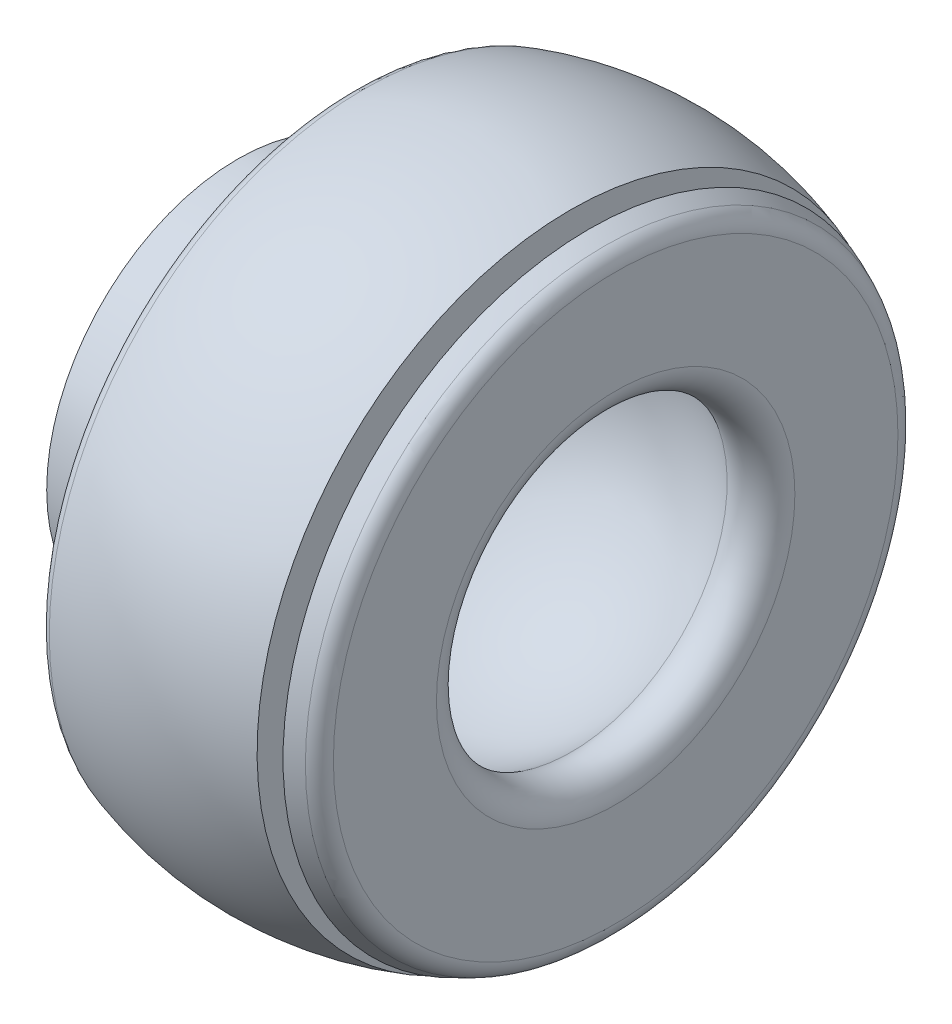
ISO-10303-21;
HEADER;
FILE_DESCRIPTION(('STEP AP214'),'2;1');
FILE_NAME('part.step','',(''),(''),'','','');
FILE_SCHEMA(('AUTOMOTIVE_DESIGN { 1 0 10303 214 1 1 1 1 }'));
ENDSEC;
DATA;
#1=APPLICATION_CONTEXT('core data for automotive mechanical design processes');
#2=APPLICATION_PROTOCOL_DEFINITION('international standard','automotive_design',2000,#1);
#3=PRODUCT_CONTEXT('',#1,'mechanical');
#4=PRODUCT('Part','Part','',(#3));
#5=PRODUCT_RELATED_PRODUCT_CATEGORY('part','',(#4));
#6=PRODUCT_DEFINITION_FORMATION('','',#4);
#7=PRODUCT_DEFINITION_CONTEXT('part definition',#1,'design');
#8=PRODUCT_DEFINITION('design','',#6,#7);
#9=PRODUCT_DEFINITION_SHAPE('','',#8);
#10=(LENGTH_UNIT() NAMED_UNIT(*) SI_UNIT(.MILLI.,.METRE.));
#11=(NAMED_UNIT(*) PLANE_ANGLE_UNIT() SI_UNIT($,.RADIAN.));
#12=(NAMED_UNIT(*) SI_UNIT($,.STERADIAN.) SOLID_ANGLE_UNIT());
#13=UNCERTAINTY_MEASURE_WITH_UNIT(LENGTH_MEASURE(1.E-05),#10,'distance_accuracy_value','');
#14=(GEOMETRIC_REPRESENTATION_CONTEXT(3) GLOBAL_UNCERTAINTY_ASSIGNED_CONTEXT((#13)) GLOBAL_UNIT_ASSIGNED_CONTEXT((#10,
#11,#12)) REPRESENTATION_CONTEXT('',''));
#15=CARTESIAN_POINT('',(0.,0.,0.));
#16=DIRECTION('',(0.,0.,1.));
#17=DIRECTION('',(1.,0.,0.));
#18=AXIS2_PLACEMENT_3D('',#15,#16,#17);
#19=CARTESIAN_POINT('',(3.25,0.,0.));
#20=DIRECTION('',(-1.,0.,0.));
#21=DIRECTION('',(0.,0.,1.));
#22=AXIS2_PLACEMENT_3D('',#19,#20,#21);
#23=TOROIDAL_SURFACE('',#22,4.74341649025257,0.749999999999999);
#24=CARTESIAN_POINT('',(4.,0.,0.));
#25=DIRECTION('',(-1.,0.,0.));
#26=DIRECTION('',(0.,0.,1.));
#27=AXIS2_PLACEMENT_3D('',#24,#25,#26);
#28=CIRCLE('',#27,4.74341649025257);
#29=CARTESIAN_POINT('',(4.,0.,4.74341649025257));
#30=VERTEX_POINT('',#29);
#31=EDGE_CURVE('E91',#30,#30,#28,.T.);
#32=ORIENTED_EDGE('',*,*,#31,.F.);
#33=EDGE_LOOP('',(#32));
#34=FACE_BOUND('',#33,.T.);
#35=CARTESIAN_POINT('',(2.82608695652174,0.,0.));
#36=DIRECTION('',(-1.,0.,0.));
#37=DIRECTION('',(0.,0.,1.));
#38=AXIS2_PLACEMENT_3D('',#35,#36,#37);
#39=CIRCLE('',#38,4.12470999152397);
#40=CARTESIAN_POINT('',(2.82608695652174,4.12470999152397,0.));
#41=VERTEX_POINT('',#40);
#42=EDGE_CURVE('E10',#41,#41,#39,.T.);
#43=ORIENTED_EDGE('',*,*,#42,.T.);
#44=EDGE_LOOP('',(#43));
#45=FACE_BOUND('',#44,.T.);
#46=ADVANCED_FACE('F30',(#34,#45),#23,.T.);
#47=CARTESIAN_POINT('',(0.,0.,0.));
#48=DIRECTION('',(-1.,0.,0.));
#49=DIRECTION('',(0.,1.,0.));
#50=AXIS2_PLACEMENT_3D('',#47,#48,#49);
#51=SPHERICAL_SURFACE('',#50,5.);
#52=CARTESIAN_POINT('',(-2.67999848180705,0.,0.));
#53=DIRECTION('',(-1.,0.,0.));
#54=DIRECTION('',(0.,0.,1.));
#55=AXIS2_PLACEMENT_3D('',#52,#53,#54);
#56=CIRCLE('',#55,4.22109087055845);
#57=CARTESIAN_POINT('',(-2.67999848180705,4.22109087055845,0.));
#58=VERTEX_POINT('',#57);
#59=EDGE_CURVE('E36',#58,#58,#56,.T.);
#60=CARTESIAN_POINT('',(2.82608695652174,4.12470999152397,0.));
#61=CARTESIAN_POINT('',(2.77597251907921,4.15904704738985,0.));
#62=CARTESIAN_POINT('',(2.72523174466852,4.192469897466,0.));
#63=CARTESIAN_POINT('',(2.62256616791044,4.2574447462577,0.));
#64=CARTESIAN_POINT('',(2.57064136556305,4.28899674497326,0.));
#65=CARTESIAN_POINT('',(2.46567637893118,4.35018745126266,0.));
#66=CARTESIAN_POINT('',(2.41263619464671,4.3798261588365,0.));
#67=CARTESIAN_POINT('',(2.30551099330191,4.43715105066407,0.));
#68=CARTESIAN_POINT('',(2.25142597624159,4.4648372349178,0.));
#69=CARTESIAN_POINT('',(2.14228293356314,4.5182202632786,0.));
#70=CARTESIAN_POINT('',(2.08722490794503,4.54391710738566,0.));
#71=CARTESIAN_POINT('',(1.97620899520066,4.59328732913464,0.));
#72=CARTESIAN_POINT('',(1.9202511080744,4.61696070677656,0.));
#73=CARTESIAN_POINT('',(1.80750980665723,4.66225254449637,0.));
#74=CARTESIAN_POINT('',(1.75072639236632,4.68387100457425,0.));
#75=CARTESIAN_POINT('',(1.63640946978969,4.72502428931104,0.));
#76=CARTESIAN_POINT('',(1.57887596150398,4.74455911396995,0.));
#77=CARTESIAN_POINT('',(1.46313527997182,4.7815191770549,0.));
#78=CARTESIAN_POINT('',(1.40492810672537,4.79894441548096,0.));
#79=CARTESIAN_POINT('',(1.28791741937756,4.83166215796744,0.));
#80=CARTESIAN_POINT('',(1.2291139052762,4.84695466202788,0.));
#81=CARTESIAN_POINT('',(1.11098865247882,4.87538662076962,0.));
#82=CARTESIAN_POINT('',(1.05166691378281,4.88852607545093,0.));
#83=CARTESIAN_POINT('',(0.932584016491968,4.91263448061097,0.));
#84=CARTESIAN_POINT('',(0.872822857897141,4.9236034310897,0.));
#85=CARTESIAN_POINT('',(0.752940509239458,4.94335625637618,0.));
#86=CARTESIAN_POINT('',(0.692819319176603,4.95214013118394,0.));
#87=CARTESIAN_POINT('',(0.572296774290548,4.96751113637837,0.));
#88=CARTESIAN_POINT('',(0.511895419467348,4.97409826676504,0.));
#89=CARTESIAN_POINT('',(0.390892783946952,4.98506703258491,0.));
#90=CARTESIAN_POINT('',(0.330291503249754,4.98944866801811,0.));
#91=CARTESIAN_POINT('',(0.208969520455011,4.9960006232413,0.));
#92=CARTESIAN_POINT('',(0.148248818357465,4.99817094303129,0.));
#93=CARTESIAN_POINT('',(0.0267686558784625,5.00029738385319,0.));
#94=CARTESIAN_POINT('',(-0.0339908045029948,5.00025350488511,0.));
#95=CARTESIAN_POINT('',(-0.155467768945771,4.99795160648097,0.));
#96=CARTESIAN_POINT('',(-0.216185273007091,4.9956935870449,0.));
#97=CARTESIAN_POINT('',(-0.337497665941503,4.98896640732233,0.));
#98=CARTESIAN_POINT('',(-0.398092554814596,4.98449724703582,0.));
#99=CARTESIAN_POINT('',(-0.519079221390044,4.97335372257272,0.));
#100=CARTESIAN_POINT('',(-0.579470999092399,4.96667935839613,0.));
#101=CARTESIAN_POINT('',(-0.699971217162338,4.95113429256875,0.));
#102=CARTESIAN_POINT('',(-0.760079657529924,4.94226359091796,0.));
#103=CARTESIAN_POINT('',(-0.879933351160468,4.92233763423688,0.));
#104=CARTESIAN_POINT('',(-0.939678604423428,4.91128237920657,0.));
#105=CARTESIAN_POINT('',(-1.05872655654016,4.88700200187944,0.));
#106=CARTESIAN_POINT('',(-1.11802925539394,4.87377687958261,0.));
#107=CARTESIAN_POINT('',(-1.23611331930025,4.8451743363672,0.));
#108=CARTESIAN_POINT('',(-1.29489468435279,4.82979691544861,0.));
#109=CARTESIAN_POINT('',(-1.41185799377983,4.79691020274201,0.));
#110=CARTESIAN_POINT('',(-1.47003993815434,4.77940091095399,0.));
#111=CARTESIAN_POINT('',(-1.58572711578335,4.74227371655083,0.));
#112=CARTESIAN_POINT('',(-1.64323234903786,4.72265581393568,0.));
#113=CARTESIAN_POINT('',(-1.75748971239773,4.68133745811983,0.));
#114=CARTESIAN_POINT('',(-1.81424184250309,4.65963700491914,0.));
#115=CARTESIAN_POINT('',(-1.92691761003032,4.61418237820019,0.));
#116=CARTESIAN_POINT('',(-1.98284124745219,4.59042820468194,0.));
#117=CARTESIAN_POINT('',(-2.09378573301684,4.54089768272959,0.));
#118=CARTESIAN_POINT('',(-2.14880658115963,4.51512133429549,0.));
#119=CARTESIAN_POINT('',(-2.25787241942897,4.46158074306964,0.));
#120=CARTESIAN_POINT('',(-2.31191740955552,4.43381650027789,0.));
#121=CARTESIAN_POINT('',(-2.41895965279813,4.37633685939164,0.));
#122=CARTESIAN_POINT('',(-2.47195690591419,4.34662146129714,0.));
#123=CARTESIAN_POINT('',(-2.57683358587715,4.28527952110513,0.));
#124=CARTESIAN_POINT('',(-2.62871301272406,4.25365297900762,0.));
#125=CARTESIAN_POINT('',(-2.67999848180705,4.22109087055845,0.));
#126=B_SPLINE_CURVE_WITH_KNOTS('',3,(#60,#61,#62,#63,#64,#65,#66,#67,#68,#69,#70,#71,#72,#73,
#74,#75,#76,#77,#78,#79,#80,#81,#82,#83,#84,#85,#86,#87,#88,#89,#90,#91,#92,#93,#94,#95,#96,#97,
#98,#99,#100,#101,#102,#103,#104,#105,#106,#107,#108,#109,#110,#111,#112,#113,#114,#115,#116,
#117,#118,#119,#120,#121,#122,#123,#124,#125),.UNSPECIFIED.,.F.,.F.,(4,2,2,2,2,2,2,2,2,2,2,2,2,
2,2,2,2,2,2,2,2,2,2,2,2,2,2,2,2,2,2,2,4),(0.,0.182238071364263,0.364476142728527,
0.546714214092789,0.728952285457052,0.911190356821315,1.09342842818558,1.27566649954984,
1.4579045709141,1.64014264227837,1.82238071364263,2.00461878500689,2.18685685637116,
2.36909492773542,2.55133299909968,2.73357107046394,2.91580914182821,3.09804721319247,
3.28028528455673,3.46252335592099,3.64476142728526,3.82699949864952,4.00923757001378,
4.19147564137805,4.37371371274231,4.55595178410657,4.73818985547083,4.9204279268351,
5.10266599819936,5.28490406956362,5.46714214092789,5.64938021229215,5.83161828365641),.UNSPECIFIED.);
#127=EDGE_CURVE('BSEAM98',#41,#58,#126,.T.);
#128=ORIENTED_EDGE('',*,*,#42,.F.);
#129=ORIENTED_EDGE('',*,*,#59,.T.);
#130=ORIENTED_EDGE('',*,*,#127,.T.);
#131=ORIENTED_EDGE('',*,*,#127,.F.);
#132=EDGE_LOOP('',(#128,#130,#129,#131));
#133=FACE_BOUND('',#132,.T.);
#134=ADVANCED_FACE('F98',(#133),#51,.F.);
#135=CARTESIAN_POINT('',(-3.21599817816846,0.,0.));
#136=DIRECTION('',(-1.,0.,0.));
#137=DIRECTION('',(0.,0.,1.));
#138=AXIS2_PLACEMENT_3D('',#135,#136,#137);
#139=TOROIDAL_SURFACE('',#138,5.06530904467015,1.);
#140=ORIENTED_EDGE('',*,*,#59,.F.);
#141=EDGE_LOOP('',(#140));
#142=FACE_BOUND('',#141,.T.);
#143=CARTESIAN_POINT('',(-3.41734726076312,0.,0.));
#144=DIRECTION('',(-1.,0.,0.));
#145=DIRECTION('',(0.,0.,1.));
#146=AXIS2_PLACEMENT_3D('',#143,#144,#145);
#147=CIRCLE('',#146,4.0857894956369);
#148=CARTESIAN_POINT('',(-3.41734726076312,0.,4.0857894956369));
#149=VERTEX_POINT('',#148);
#150=EDGE_CURVE('E40',#149,#149,#147,.T.);
#151=ORIENTED_EDGE('',*,*,#150,.T.);
#152=EDGE_LOOP('',(#151));
#153=FACE_BOUND('',#152,.T.);
#154=ADVANCED_FACE('F102',(#142,#153),#139,.T.);
#155=CARTESIAN_POINT('',(-6.,0.,0.));
#156=DIRECTION('',(-1.,0.,0.));
#157=DIRECTION('',(0.,0.,1.));
#158=AXIS2_PLACEMENT_3D('',#155,#156,#157);
#159=CONICAL_SURFACE('',#158,4.61667707232608,0.202735016432704);
#160=ORIENTED_EDGE('',*,*,#150,.F.);
#161=EDGE_LOOP('',(#160));
#162=FACE_BOUND('',#161,.T.);
#163=CARTESIAN_POINT('',(-6.,0.,0.));
#164=DIRECTION('',(-1.,0.,0.));
#165=DIRECTION('',(0.,0.,1.));
#166=AXIS2_PLACEMENT_3D('',#163,#164,#165);
#167=CIRCLE('',#166,4.61667707232608);
#168=CARTESIAN_POINT('',(-6.,0.,4.61667707232608));
#169=VERTEX_POINT('',#168);
#170=EDGE_CURVE('E44',#169,#169,#167,.T.);
#171=ORIENTED_EDGE('',*,*,#170,.T.);
#172=EDGE_LOOP('',(#171));
#173=FACE_BOUND('',#172,.T.);
#174=ADVANCED_FACE('F107',(#162,#173),#159,.F.);
#175=CARTESIAN_POINT('',(-6.,5.05833853616304,0.));
#176=DIRECTION('',(1.,0.,0.));
#177=DIRECTION('',(0.,0.,-1.));
#178=AXIS2_PLACEMENT_3D('',#175,#176,#177);
#179=PLANE('',#178);
#180=ORIENTED_EDGE('',*,*,#170,.F.);
#181=EDGE_LOOP('',(#180));
#182=FACE_BOUND('',#181,.T.);
#183=CARTESIAN_POINT('',(-6.,0.,0.));
#184=DIRECTION('',(-1.,0.,0.));
#185=DIRECTION('',(0.,0.,1.));
#186=AXIS2_PLACEMENT_3D('',#183,#184,#185);
#187=CIRCLE('',#186,5.05833853616304);
#188=CARTESIAN_POINT('',(-6.,0.,5.05833853616304));
#189=VERTEX_POINT('',#188);
#190=EDGE_CURVE('E49',#189,#189,#187,.T.);
#191=ORIENTED_EDGE('',*,*,#190,.T.);
#192=EDGE_LOOP('',(#191));
#193=FACE_BOUND('',#192,.T.);
#194=ADVANCED_FACE('F113',(#182,#193),#179,.F.);
#195=CARTESIAN_POINT('',(-3.,0.,0.));
#196=DIRECTION('',(1.,0.,0.));
#197=DIRECTION('',(0.,0.,-1.));
#198=AXIS2_PLACEMENT_3D('',#195,#196,#197);
#199=CONICAL_SURFACE('',#198,5.49999999999997,0.146170496250432);
#200=ORIENTED_EDGE('',*,*,#190,.F.);
#201=EDGE_LOOP('',(#200));
#202=FACE_BOUND('',#201,.T.);
#203=CARTESIAN_POINT('',(-3.,0.,0.));
#204=DIRECTION('',(-1.,0.,0.));
#205=DIRECTION('',(0.,0.,1.));
#206=AXIS2_PLACEMENT_3D('',#203,#204,#205);
#207=CIRCLE('',#206,5.49999999999997);
#208=CARTESIAN_POINT('',(-3.,0.,5.49999999999997));
#209=VERTEX_POINT('',#208);
#210=EDGE_CURVE('E52',#209,#209,#207,.T.);
#211=ORIENTED_EDGE('',*,*,#210,.T.);
#212=EDGE_LOOP('',(#211));
#213=FACE_BOUND('',#212,.T.);
#214=ADVANCED_FACE('F117',(#202,#213),#199,.T.);
#215=CARTESIAN_POINT('',(-16.6495348305393,0.,0.));
#216=DIRECTION('',(-1.,0.,0.));
#217=DIRECTION('',(0.,0.,1.));
#218=AXIS2_PLACEMENT_3D('',#215,#216,#217);
#219=CYLINDRICAL_SURFACE('',#218,5.49999999999999);
#220=ORIENTED_EDGE('',*,*,#210,.F.);
#221=EDGE_LOOP('',(#220));
#222=FACE_BOUND('',#221,.T.);
#223=CARTESIAN_POINT('',(-1.94219997841089,0.,0.));
#224=DIRECTION('',(-1.,0.,0.));
#225=DIRECTION('',(0.,0.,1.));
#226=AXIS2_PLACEMENT_3D('',#223,#224,#225);
#227=CIRCLE('',#226,5.5);
#228=CARTESIAN_POINT('',(-1.94219997841089,0.,5.5));
#229=VERTEX_POINT('',#228);
#230=EDGE_CURVE('E55',#229,#229,#227,.T.);
#231=ORIENTED_EDGE('',*,*,#230,.T.);
#232=EDGE_LOOP('',(#231));
#233=FACE_BOUND('',#232,.T.);
#234=ADVANCED_FACE('F121',(#222,#233),#219,.T.);
#235=CARTESIAN_POINT('',(-1.94219997841089,0.,0.));
#236=DIRECTION('',(-1.,0.,0.));
#237=DIRECTION('',(0.,0.,1.));
#238=AXIS2_PLACEMENT_3D('',#235,#236,#237);
#239=TOROIDAL_SURFACE('',#238,6.11324671507336,0.613246715073359);
#240=ORIENTED_EDGE('',*,*,#230,.F.);
#241=EDGE_LOOP('',(#240));
#242=FACE_BOUND('',#241,.T.);
#243=CARTESIAN_POINT('',(-1.94219997841089,0.,0.));
#244=DIRECTION('',(-1.,0.,0.));
#245=DIRECTION('',(0.,0.,1.));
#246=AXIS2_PLACEMENT_3D('',#243,#244,#245);
#247=CIRCLE('',#246,6.72649343014672);
#248=CARTESIAN_POINT('',(-1.94219997841089,0.,6.72649343014672));
#249=VERTEX_POINT('',#248);
#250=EDGE_CURVE('E58',#249,#249,#247,.T.);
#251=ORIENTED_EDGE('',*,*,#250,.T.);
#252=EDGE_LOOP('',(#251));
#253=FACE_BOUND('',#252,.T.);
#254=ADVANCED_FACE('F125',(#242,#253),#239,.F.);
#255=CARTESIAN_POINT('',(-16.6495348305393,0.,0.));
#256=DIRECTION('',(-1.,0.,0.));
#257=DIRECTION('',(0.,0.,1.));
#258=AXIS2_PLACEMENT_3D('',#255,#256,#257);
#259=CYLINDRICAL_SURFACE('',#258,6.72649343014672);
#260=ORIENTED_EDGE('',*,*,#250,.F.);
#261=EDGE_LOOP('',(#260));
#262=FACE_BOUND('',#261,.T.);
#263=CARTESIAN_POINT('',(-2.8,0.,0.));
#264=DIRECTION('',(-1.,0.,0.));
#265=DIRECTION('',(0.,0.,1.));
#266=AXIS2_PLACEMENT_3D('',#263,#264,#265);
#267=CIRCLE('',#266,6.72649343014672);
#268=CARTESIAN_POINT('',(-2.8,0.,6.72649343014672));
#269=VERTEX_POINT('',#268);
#270=EDGE_CURVE('E61',#269,#269,#267,.T.);
#271=ORIENTED_EDGE('',*,*,#270,.T.);
#272=EDGE_LOOP('',(#271));
#273=FACE_BOUND('',#272,.T.);
#274=ADVANCED_FACE('F129',(#262,#273),#259,.F.);
#275=CARTESIAN_POINT('',(-2.8,0.,0.));
#276=DIRECTION('',(-1.,0.,0.));
#277=DIRECTION('',(0.,0.,1.));
#278=AXIS2_PLACEMENT_3D('',#275,#276,#277);
#279=TOROIDAL_SURFACE('',#278,6.92649343014672,0.2);
#280=ORIENTED_EDGE('',*,*,#270,.F.);
#281=EDGE_LOOP('',(#280));
#282=FACE_BOUND('',#281,.T.);
#283=CARTESIAN_POINT('',(-3.,0.,0.));
#284=DIRECTION('',(-1.,0.,0.));
#285=DIRECTION('',(0.,0.,1.));
#286=AXIS2_PLACEMENT_3D('',#283,#284,#285);
#287=CIRCLE('',#286,6.92649343014672);
#288=CARTESIAN_POINT('',(-3.,0.,6.92649343014672));
#289=VERTEX_POINT('',#288);
#290=EDGE_CURVE('E64',#289,#289,#287,.T.);
#291=ORIENTED_EDGE('',*,*,#290,.T.);
#292=EDGE_LOOP('',(#291));
#293=FACE_BOUND('',#292,.T.);
#294=ADVANCED_FACE('F133',(#282,#293),#279,.T.);
#295=CARTESIAN_POINT('',(-3.,7.86209259675819,0.));
#296=DIRECTION('',(1.,0.,0.));
#297=DIRECTION('',(0.,0.,-1.));
#298=AXIS2_PLACEMENT_3D('',#295,#296,#297);
#299=PLANE('',#298);
#300=ORIENTED_EDGE('',*,*,#290,.F.);
#301=EDGE_LOOP('',(#300));
#302=FACE_BOUND('',#301,.T.);
#303=CARTESIAN_POINT('',(-3.,0.,0.));
#304=DIRECTION('',(-1.,0.,0.));
#305=DIRECTION('',(0.,0.,1.));
#306=AXIS2_PLACEMENT_3D('',#303,#304,#305);
#307=CIRCLE('',#306,7.86209259675819);
#308=CARTESIAN_POINT('',(-3.,0.,7.86209259675819));
#309=VERTEX_POINT('',#308);
#310=EDGE_CURVE('E67',#309,#309,#307,.T.);
#311=ORIENTED_EDGE('',*,*,#310,.T.);
#312=EDGE_LOOP('',(#311));
#313=FACE_BOUND('',#312,.T.);
#314=ADVANCED_FACE('F137',(#302,#313),#299,.F.);
#315=CARTESIAN_POINT('',(-2.5,0.,0.));
#316=DIRECTION('',(-1.,0.,0.));
#317=DIRECTION('',(0.,0.,1.));
#318=AXIS2_PLACEMENT_3D('',#315,#316,#317);
#319=TOROIDAL_SURFACE('',#318,7.86209259675819,0.5);
#320=ORIENTED_EDGE('',*,*,#310,.F.);
#321=EDGE_LOOP('',(#320));
#322=FACE_BOUND('',#321,.T.);
#323=CARTESIAN_POINT('',(-2.65151515151515,0.,0.));
#324=DIRECTION('',(-1.,0.,0.));
#325=DIRECTION('',(0.,0.,1.));
#326=AXIS2_PLACEMENT_3D('',#323,#324,#325);
#327=CIRCLE('',#326,8.33858305716778);
#328=CARTESIAN_POINT('',(-2.65151515151515,8.33858305716778,0.));
#329=VERTEX_POINT('',#328);
#330=EDGE_CURVE('E70',#329,#329,#327,.T.);
#331=ORIENTED_EDGE('',*,*,#330,.T.);
#332=EDGE_LOOP('',(#331));
#333=FACE_BOUND('',#332,.T.);
#334=ADVANCED_FACE('F141',(#322,#333),#319,.T.);
#335=CARTESIAN_POINT('',(0.,0.,0.));
#336=DIRECTION('',(-1.,0.,0.));
#337=DIRECTION('',(0.,1.,0.));
#338=AXIS2_PLACEMENT_3D('',#335,#336,#337);
#339=SPHERICAL_SURFACE('',#338,8.75);
#340=CARTESIAN_POINT('',(2.8,0.,0.));
#341=DIRECTION('',(-1.,0.,0.));
#342=DIRECTION('',(0.,0.,1.));
#343=AXIS2_PLACEMENT_3D('',#340,#341,#342);
#344=CIRCLE('',#343,8.28990349762891);
#345=CARTESIAN_POINT('',(2.8,8.28990349762891,0.));
#346=VERTEX_POINT('',#345);
#347=EDGE_CURVE('E73',#346,#346,#344,.T.);
#348=CARTESIAN_POINT('',(-2.65151515151515,8.33858305716778,0.));
#349=CARTESIAN_POINT('',(-2.59648049535739,8.35608314415254,0.));
#350=CARTESIAN_POINT('',(-2.54127254373623,8.37303823603645,0.));
#351=CARTESIAN_POINT('',(-2.43053179304678,8.40585212169417,0.));
#352=CARTESIAN_POINT('',(-2.3749989939785,8.42171091546798,0.));
#353=CARTESIAN_POINT('',(-2.2636302918745,8.45232589699711,0.));
#354=CARTESIAN_POINT('',(-2.20779438883879,8.46708208475242,0.));
#355=CARTESIAN_POINT('',(-2.09584137522787,8.49548609374716,0.));
#356=CARTESIAN_POINT('',(-2.03972426465266,8.50913391498658,0.));
#357=CARTESIAN_POINT('',(-1.92723083348853,8.53531583410569,0.));
#358=CARTESIAN_POINT('',(-1.87085451289961,8.54784993198538,0.));
#359=CARTESIAN_POINT('',(-1.75786476330129,8.57179949241955,0.));
#360=CARTESIAN_POINT('',(-1.70125133429188,8.58321495497403,0.));
#361=CARTESIAN_POINT('',(-1.58780956174238,8.60492276911285,0.));
#362=CARTESIAN_POINT('',(-1.53098121820229,8.61521512069719,0.));
#363=CARTESIAN_POINT('',(-1.41713189490956,8.63467267813495,0.));
#364=CARTESIAN_POINT('',(-1.36011091515693,8.64383788398838,0.));
#365=CARTESIAN_POINT('',(-1.24589867322885,8.66103755691675,0.));
#366=CARTESIAN_POINT('',(-1.1887074110534,8.66907202399169,0.));
#367=CARTESIAN_POINT('',(-1.07417702483746,8.68400706963901,0.));
#368=CARTESIAN_POINT('',(-1.01683790079697,8.69090764821138,0.));
#369=CARTESIAN_POINT('',(-0.902034269371261,8.70357221163364,0.));
#370=CARTESIAN_POINT('',(-0.844569761986049,8.70933619648354,0.));
#371=CARTESIAN_POINT('',(-0.729537891545872,8.71972531282018,0.));
#372=CARTESIAN_POINT('',(-0.671970528490907,8.72435044430691,0.));
#373=CARTESIAN_POINT('',(-0.556755514708212,8.73246004073772,0.));
#374=CARTESIAN_POINT('',(-0.499107863980482,8.73594450568178,0.));
#375=CARTESIAN_POINT('',(-0.383754874324298,8.74177140302073,0.));
#376=CARTESIAN_POINT('',(-0.326049535395843,8.74411383541563,0.));
#377=CARTESIAN_POINT('',(-0.2106037914256,8.74765574935799,0.));
#378=CARTESIAN_POINT('',(-0.152863386383812,8.74885523090548,0.));
#379=CARTESIAN_POINT('',(-0.0373701460211821,8.75011077292312,0.));
#380=CARTESIAN_POINT('',(0.020382689299659,8.75016683339328,0.));
#381=CARTESIAN_POINT('',(0.135878149513101,8.74913551127903,0.));
#382=CARTESIAN_POINT('',(0.193620774405702,8.74804812869461,0.));
#383=CARTESIAN_POINT('',(0.309073177058142,8.74473034675524,0.));
#384=CARTESIAN_POINT('',(0.36678295481798,8.74249994740028,0.));
#385=CARTESIAN_POINT('',(0.482147039377353,8.73689700629797,0.));
#386=CARTESIAN_POINT('',(0.539801346176888,8.73352446455063,0.));
#387=CARTESIAN_POINT('',(0.655031886734268,8.72563856079314,0.));
#388=CARTESIAN_POINT('',(0.712608120492114,8.72112519878299,0.));
#389=CARTESIAN_POINT('',(0.8276599434915,8.71095942386246,0.));
#390=CARTESIAN_POINT('',(0.885135532733041,8.70530701095208,0.));
#391=CARTESIAN_POINT('',(0.999963534680705,8.69286535013331,0.));
#392=CARTESIAN_POINT('',(1.05731594738683,8.68607610222493,0.));
#393=CARTESIAN_POINT('',(1.17187511253289,8.67136343298228,0.));
#394=CARTESIAN_POINT('',(1.22908186497282,8.66344001164802,0.));
#395=CARTESIAN_POINT('',(1.34332728295956,8.64646210175614,0.));
#396=CARTESIAN_POINT('',(1.40036594850635,8.63740761319852,0.));
#397=CARTESIAN_POINT('',(1.51425283197096,8.61817111846067,0.));
#398=CARTESIAN_POINT('',(1.57110104988878,8.60798911228044,0.));
#399=CARTESIAN_POINT('',(1.68458475203372,8.58650157395858,0.));
#400=CARTESIAN_POINT('',(1.74122023626085,8.57519604181694,0.));
#401=CARTESIAN_POINT('',(1.8542562683102,8.55146588352851,0.));
#402=CARTESIAN_POINT('',(1.91065681613244,8.53904125738171,0.));
#403=CARTESIAN_POINT('',(2.02320086494586,8.51307778234533,0.));
#404=CARTESIAN_POINT('',(2.07934436593704,8.49953893345575,0.));
#405=CARTESIAN_POINT('',(2.19135231073574,8.47135231879898,0.));
#406=CARTESIAN_POINT('',(2.24721675454326,8.45670455303178,0.));
#407=CARTESIAN_POINT('',(2.35864468661732,8.42630585343395,0.));
#408=CARTESIAN_POINT('',(2.41420817488387,8.41055491960332,0.));
#409=CARTESIAN_POINT('',(2.52501240580875,8.37795603447663,0.));
#410=CARTESIAN_POINT('',(2.58025314846708,8.36110808318056,0.));
#411=CARTESIAN_POINT('',(2.69039026080761,8.3263218583134,0.));
#412=CARTESIAN_POINT('',(2.74528663048982,8.30838358474231,0.));
#413=CARTESIAN_POINT('',(2.8,8.28990349762891,0.));
#414=B_SPLINE_CURVE_WITH_KNOTS('',3,(#348,#349,#350,#351,#352,#353,#354,#355,#356,#357,#358,
#359,#360,#361,#362,#363,#364,#365,#366,#367,#368,#369,#370,#371,#372,#373,#374,#375,#376,#377,
#378,#379,#380,#381,#382,#383,#384,#385,#386,#387,#388,#389,#390,#391,#392,#393,#394,#395,#396,
#397,#398,#399,#400,#401,#402,#403,#404,#405,#406,#407,#408,#409,#410,#411,#412,#413),
.UNSPECIFIED.,.F.,.F.,(4,2,2,2,2,2,2,2,2,2,2,2,2,2,2,2,2,2,2,2,2,2,2,2,2,2,2,2,2,2,2,2,4),(0.,
0.17324726723007,0.346494534460141,0.519741801690211,0.692989068920282,0.866236336150352,
1.03948360338042,1.21273087061049,1.38597813784056,1.55922540507063,1.73247267230071,
1.90571993953078,2.07896720676085,2.25221447399092,2.42546174122099,2.59870900845106,
2.77195627568113,2.9452035429112,3.11845081014127,3.29169807737134,3.46494534460141,
3.63819261183148,3.81143987906155,3.98468714629162,4.15793441352169,4.33118168075176,
4.50442894798183,4.67767621521191,4.85092348244198,5.02417074967205,5.19741801690212,
5.37066528413219,5.54391255136226),.UNSPECIFIED.);
#415=EDGE_CURVE('BSEAM145',#329,#346,#414,.T.);
#416=ORIENTED_EDGE('',*,*,#330,.F.);
#417=ORIENTED_EDGE('',*,*,#347,.T.);
#418=ORIENTED_EDGE('',*,*,#415,.T.);
#419=ORIENTED_EDGE('',*,*,#415,.F.);
#420=EDGE_LOOP('',(#416,#418,#417,#419));
#421=FACE_BOUND('',#420,.T.);
#422=ADVANCED_FACE('F145',(#421),#339,.T.);
#423=CARTESIAN_POINT('',(2.8,8.28990349762891,0.));
#424=DIRECTION('',(-1.,0.,0.));
#425=DIRECTION('',(0.,0.,1.));
#426=AXIS2_PLACEMENT_3D('',#423,#424,#425);
#427=PLANE('',#426);
#428=ORIENTED_EDGE('',*,*,#347,.F.);
#429=EDGE_LOOP('',(#428));
#430=FACE_BOUND('',#429,.T.);
#431=CARTESIAN_POINT('',(2.8,0.,0.));
#432=DIRECTION('',(-1.,0.,0.));
#433=DIRECTION('',(0.,0.,1.));
#434=AXIS2_PLACEMENT_3D('',#431,#432,#433);
#435=CIRCLE('',#434,6.11324671507338);
#436=CARTESIAN_POINT('',(2.8,0.,6.11324671507338));
#437=VERTEX_POINT('',#436);
#438=EDGE_CURVE('E76',#437,#437,#435,.T.);
#439=ORIENTED_EDGE('',*,*,#438,.T.);
#440=EDGE_LOOP('',(#439));
#441=FACE_BOUND('',#440,.T.);
#442=ADVANCED_FACE('F149',(#430,#441),#427,.F.);
#443=CARTESIAN_POINT('',(3.05,0.,0.));
#444=DIRECTION('',(-1.,0.,0.));
#445=DIRECTION('',(0.,0.,1.));
#446=AXIS2_PLACEMENT_3D('',#443,#444,#445);
#447=TOROIDAL_SURFACE('',#446,6.11324671507338,0.249999999999998);
#448=ORIENTED_EDGE('',*,*,#438,.F.);
#449=EDGE_LOOP('',(#448));
#450=FACE_BOUND('',#449,.T.);
#451=CARTESIAN_POINT('',(3.3,0.,0.));
#452=DIRECTION('',(-1.,0.,0.));
#453=DIRECTION('',(0.,0.,1.));
#454=AXIS2_PLACEMENT_3D('',#451,#452,#453);
#455=CIRCLE('',#454,6.11324671507338);
#456=CARTESIAN_POINT('',(3.3,0.,6.11324671507338));
#457=VERTEX_POINT('',#456);
#458=EDGE_CURVE('E79',#457,#457,#455,.T.);
#459=ORIENTED_EDGE('',*,*,#458,.T.);
#460=EDGE_LOOP('',(#459));
#461=FACE_BOUND('',#460,.T.);
#462=ADVANCED_FACE('F153',(#450,#461),#447,.F.);
#463=CARTESIAN_POINT('',(3.3,8.1038571063414,0.));
#464=DIRECTION('',(1.,0.,0.));
#465=DIRECTION('',(0.,0.,-1.));
#466=AXIS2_PLACEMENT_3D('',#463,#464,#465);
#467=PLANE('',#466);
#468=ORIENTED_EDGE('',*,*,#458,.F.);
#469=EDGE_LOOP('',(#468));
#470=FACE_BOUND('',#469,.T.);
#471=CARTESIAN_POINT('',(3.3,0.,0.));
#472=DIRECTION('',(-1.,0.,0.));
#473=DIRECTION('',(0.,0.,1.));
#474=AXIS2_PLACEMENT_3D('',#471,#472,#473);
#475=CIRCLE('',#474,8.1038571063414);
#476=CARTESIAN_POINT('',(3.3,8.1038571063414,0.));
#477=VERTEX_POINT('',#476);
#478=EDGE_CURVE('E82',#477,#477,#475,.T.);
#479=ORIENTED_EDGE('',*,*,#478,.T.);
#480=EDGE_LOOP('',(#479));
#481=FACE_BOUND('',#480,.T.);
#482=ADVANCED_FACE('F157',(#470,#481),#467,.F.);
#483=CARTESIAN_POINT('',(0.,0.,0.));
#484=DIRECTION('',(-1.,0.,0.));
#485=DIRECTION('',(0.,1.,0.));
#486=AXIS2_PLACEMENT_3D('',#483,#484,#485);
#487=SPHERICAL_SURFACE('',#486,8.75);
#488=CARTESIAN_POINT('',(3.71212121212121,0.,0.));
#489=DIRECTION('',(-1.,0.,0.));
#490=DIRECTION('',(0.,0.,1.));
#491=AXIS2_PLACEMENT_3D('',#488,#489,#490);
#492=CIRCLE('',#491,7.92355072593845);
#493=CARTESIAN_POINT('',(3.71212121212121,7.92355072593845,0.));
#494=VERTEX_POINT('',#493);
#495=EDGE_CURVE('E85',#494,#494,#492,.T.);
#496=CARTESIAN_POINT('',(3.3,8.1038571063414,0.));
#497=CARTESIAN_POINT('',(3.30434026781889,8.10208969070415,0.));
#498=CARTESIAN_POINT('',(3.30867911574516,8.10031878821636,0.));
#499=CARTESIAN_POINT('',(3.31735396061703,8.09677001412569,0.));
#500=CARTESIAN_POINT('',(3.32168995756263,8.09499214252281,0.));
#501=CARTESIAN_POINT('',(3.33035908927772,8.09142943478792,0.));
#502=CARTESIAN_POINT('',(3.33469222404721,8.08964459865593,0.));
#503=CARTESIAN_POINT('',(3.34335562022398,8.08606796647161,0.));
#504=CARTESIAN_POINT('',(3.34768588163128,8.08427617041929,0.));
#505=CARTESIAN_POINT('',(3.35634351990447,8.08068562301977,0.));
#506=CARTESIAN_POINT('',(3.36067089677038,8.07888687167257,0.));
#507=CARTESIAN_POINT('',(3.3693227547892,8.07528241832708,0.));
#508=CARTESIAN_POINT('',(3.37364723594212,8.07347671632878,0.));
#509=CARTESIAN_POINT('',(3.3822932913708,8.06985836634268,0.));
#510=CARTESIAN_POINT('',(3.38661486564656,8.06804571835488,0.));
#511=CARTESIAN_POINT('',(3.39525509616428,8.06441348106936,0.));
#512=CARTESIAN_POINT('',(3.39957375240624,8.06259389177164,0.));
#513=CARTESIAN_POINT('',(3.40820813570724,8.05894777656375,0.));
#514=CARTESIAN_POINT('',(3.41252386276628,8.05712125065358,0.));
#515=CARTESIAN_POINT('',(3.42115237655987,8.0534612669362,0.));
#516=CARTESIAN_POINT('',(3.42546516329442,8.05162780912898,0.));
#517=CARTESIAN_POINT('',(3.43408778530508,8.04795396635078,0.));
#518=CARTESIAN_POINT('',(3.43839762058119,8.04611358137979,0.));
#519=CARTESIAN_POINT('',(3.44701432854861,8.04242588902524,0.));
#520=CARTESIAN_POINT('',(3.45132120123993,8.04057858164166,0.));
#521=CARTESIAN_POINT('',(3.45993197291906,8.03687704923095,0.));
#522=CARTESIAN_POINT('',(3.46423587190688,8.03502282420382,0.));
#523=CARTESIAN_POINT('',(3.47284068506801,8.03130746129291,0.));
#524=CARTESIAN_POINT('',(3.47714159924132,8.02944632340913,0.));
#525=CARTESIAN_POINT('',(3.4857404316701,8.02571713958965,0.));
#526=CARTESIAN_POINT('',(3.49003834992558,8.02384909365396,0.));
#527=CARTESIAN_POINT('',(3.49863117942312,8.02010609855326,0.));
#528=CARTESIAN_POINT('',(3.50292609066518,8.01823114938824,0.));
#529=CARTESIAN_POINT('',(3.51151289504808,8.01447435266929,0.));
#530=CARTESIAN_POINT('',(3.51580478818892,8.01259250511535,0.));
#531=CARTESIAN_POINT('',(3.52438554528933,8.00882191647676,0.));
#532=CARTESIAN_POINT('',(3.5286744092489,8.0069331753921,0.));
#533=CARTESIAN_POINT('',(3.53724909691459,8.0031488045681,0.));
#534=CARTESIAN_POINT('',(3.5415349206207,8.00125317482873,0.));
#535=CARTESIAN_POINT('',(3.5501035167151,7.9974550315891,0.));
#536=CARTESIAN_POINT('',(3.55438628910339,7.99555251808883,0.));
#537=CARTESIAN_POINT('',(3.56294877150566,7.99174061223893,0.));
#538=CARTESIAN_POINT('',(3.56722848151964,7.98983121988931,0.));
#539=CARTESIAN_POINT('',(3.57578482812473,7.98600556127002,0.));
#540=CARTESIAN_POINT('',(3.58006146471584,7.98408929500037,0.));
#541=CARTESIAN_POINT('',(3.58861165343453,7.98024989348809,0.));
#542=CARTESIAN_POINT('',(3.59288520556212,7.97832675824547,0.));
#543=CARTESIAN_POINT('',(3.60142921432109,7.97447362375206,0.));
#544=CARTESIAN_POINT('',(3.60569967095248,7.97254362450128,0.));
#545=CARTESIAN_POINT('',(3.61423747769437,7.96867676697406,0.));
#546=CARTESIAN_POINT('',(3.61850482780488,7.96673990869763,0.));
#547=CARTESIAN_POINT('',(3.62703641048834,7.96285933811936,0.));
#548=CARTESIAN_POINT('',(3.63130064306129,7.96091562581751,0.));
#549=CARTESIAN_POINT('',(3.63982597966104,7.95702135220632,0.));
#550=CARTESIAN_POINT('',(3.64408708368782,7.95507079089698,0.));
#551=CARTESIAN_POINT('',(3.65260615219469,7.95116282430641,0.));
#552=CARTESIAN_POINT('',(3.65686411667478,7.94920541902519,0.));
#553=CARTESIAN_POINT('',(3.66537689509577,7.94528376954408,0.));
#554=CARTESIAN_POINT('',(3.66963170903668,7.94331952534418,0.));
#555=CARTESIAN_POINT('',(3.67813817539516,7.93938420309691,0.));
#556=CARTESIAN_POINT('',(3.68238982781272,7.93741312504953,0.));
#557=CARTESIAN_POINT('',(3.69088996014789,7.93346414019487,0.));
#558=CARTESIAN_POINT('',(3.69513844006549,7.93148623338759,0.));
#559=CARTESIAN_POINT('',(3.70363221643453,7.92752359612303,0.));
#560=CARTESIAN_POINT('',(3.70787751288597,7.92553886566576,0.));
#561=CARTESIAN_POINT('',(3.71212121212121,7.92355072593845,0.));
#562=B_SPLINE_CURVE_WITH_KNOTS('',3,(#496,#497,#498,#499,#500,#501,#502,#503,#504,#505,#506,
#507,#508,#509,#510,#511,#512,#513,#514,#515,#516,#517,#518,#519,#520,#521,#522,#523,#524,#525,
#526,#527,#528,#529,#530,#531,#532,#533,#534,#535,#536,#537,#538,#539,#540,#541,#542,#543,#544,
#545,#546,#547,#548,#549,#550,#551,#552,#553,#554,#555,#556,#557,#558,#559,#560,#561),
.UNSPECIFIED.,.F.,.F.,(4,2,2,2,2,2,2,2,2,2,2,2,2,2,2,2,2,2,2,2,2,2,2,2,2,2,2,2,2,2,2,2,4),(0.,
0.0140589865369941,0.0281179730739867,0.04217695961098,0.0562359461479734,0.0702949326849667,
0.0843539192219606,0.0984129057589538,0.112471892295946,0.12653087883294,0.140589865369933,
0.154648851906926,0.168707838443919,0.182766824980913,0.196825811517906,0.2108847980549,
0.224943784591893,0.239002771128886,0.253061757665879,0.267120744202872,0.281179730739866,
0.295238717276859,0.309297703813852,0.323356690350845,0.337415676887839,0.351474663424831,
0.365533649961825,0.379592636498818,0.393651623035811,0.407710609572805,0.421769596109799,
0.435828582646792,0.449887569183785),.UNSPECIFIED.);
#563=EDGE_CURVE('BSEAM161',#477,#494,#562,.T.);
#564=ORIENTED_EDGE('',*,*,#478,.F.);
#565=ORIENTED_EDGE('',*,*,#495,.T.);
#566=ORIENTED_EDGE('',*,*,#563,.T.);
#567=ORIENTED_EDGE('',*,*,#563,.F.);
#568=EDGE_LOOP('',(#564,#566,#565,#567));
#569=FACE_BOUND('',#568,.T.);
#570=ADVANCED_FACE('F161',(#569),#487,.T.);
#571=CARTESIAN_POINT('',(3.5,0.,0.));
#572=DIRECTION('',(-1.,0.,0.));
#573=DIRECTION('',(0.,0.,1.));
#574=AXIS2_PLACEMENT_3D('',#571,#572,#573);
#575=TOROIDAL_SURFACE('',#574,7.47077639874197,0.5);
#576=ORIENTED_EDGE('',*,*,#495,.F.);
#577=EDGE_LOOP('',(#576));
#578=FACE_BOUND('',#577,.T.);
#579=CARTESIAN_POINT('',(4.,0.,0.));
#580=DIRECTION('',(-1.,0.,0.));
#581=DIRECTION('',(0.,0.,1.));
#582=AXIS2_PLACEMENT_3D('',#579,#580,#581);
#583=CIRCLE('',#582,7.47077639874197);
#584=CARTESIAN_POINT('',(4.,0.,7.47077639874197));
#585=VERTEX_POINT('',#584);
#586=EDGE_CURVE('E88',#585,#585,#583,.T.);
#587=ORIENTED_EDGE('',*,*,#586,.T.);
#588=EDGE_LOOP('',(#587));
#589=FACE_BOUND('',#588,.T.);
#590=ADVANCED_FACE('F165',(#578,#589),#575,.T.);
#591=CARTESIAN_POINT('',(4.,7.47077639874197,0.));
#592=DIRECTION('',(-1.,0.,0.));
#593=DIRECTION('',(0.,0.,1.));
#594=AXIS2_PLACEMENT_3D('',#591,#592,#593);
#595=PLANE('',#594);
#596=ORIENTED_EDGE('',*,*,#586,.F.);
#597=EDGE_LOOP('',(#596));
#598=FACE_BOUND('',#597,.T.);
#599=ORIENTED_EDGE('',*,*,#31,.T.);
#600=EDGE_LOOP('',(#599));
#601=FACE_BOUND('',#600,.T.);
#602=ADVANCED_FACE('F95',(#598,#601),#595,.F.);
#603=CLOSED_SHELL('',(#46,#134,#154,#174,#194,#214,#234,#254,#274,#294,#314,#334,#422,#442,#462,
#482,#570,#590,#602));
#604=MANIFOLD_SOLID_BREP('B2',#603);
#605=ADVANCED_BREP_SHAPE_REPRESENTATION('',(#18,#604),#14);
#606=SHAPE_DEFINITION_REPRESENTATION(#9,#605);
ENDSEC;
END-ISO-10303-21;
